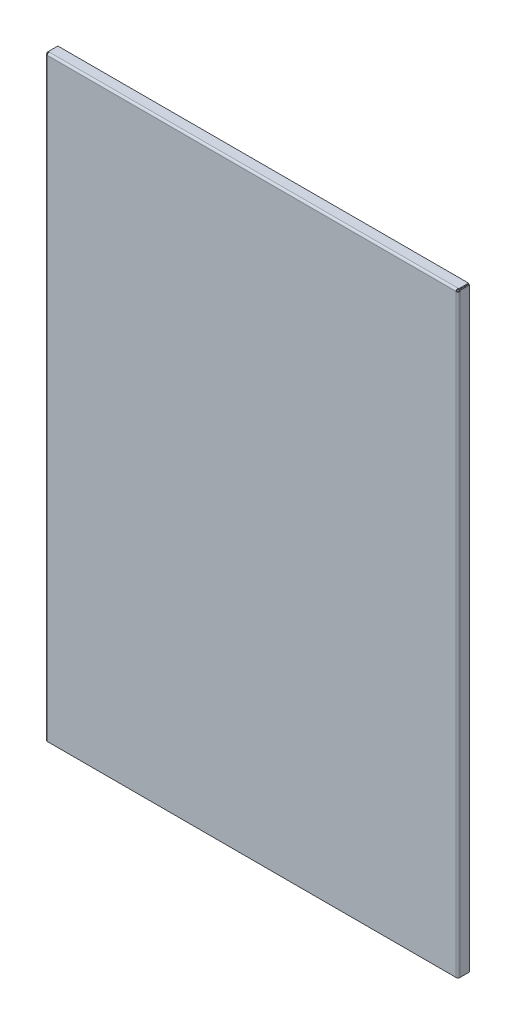
ISO-10303-21;
HEADER;
FILE_DESCRIPTION(('STEP AP214'),'2;1');
FILE_NAME('part.step','',(''),(''),'','','');
FILE_SCHEMA(('AUTOMOTIVE_DESIGN { 1 0 10303 214 1 1 1 1 }'));
ENDSEC;
DATA;
#1=APPLICATION_CONTEXT('core data for automotive mechanical design processes');
#2=APPLICATION_PROTOCOL_DEFINITION('international standard','automotive_design',2000,#1);
#3=PRODUCT_CONTEXT('',#1,'mechanical');
#4=PRODUCT('Part','Part','',(#3));
#5=PRODUCT_RELATED_PRODUCT_CATEGORY('part','',(#4));
#6=PRODUCT_DEFINITION_FORMATION('','',#4);
#7=PRODUCT_DEFINITION_CONTEXT('part definition',#1,'design');
#8=PRODUCT_DEFINITION('design','',#6,#7);
#9=PRODUCT_DEFINITION_SHAPE('','',#8);
#10=(LENGTH_UNIT() NAMED_UNIT(*) SI_UNIT(.MILLI.,.METRE.));
#11=(NAMED_UNIT(*) PLANE_ANGLE_UNIT() SI_UNIT($,.RADIAN.));
#12=(NAMED_UNIT(*) SI_UNIT($,.STERADIAN.) SOLID_ANGLE_UNIT());
#13=UNCERTAINTY_MEASURE_WITH_UNIT(LENGTH_MEASURE(1.E-05),#10,'distance_accuracy_value','');
#14=(GEOMETRIC_REPRESENTATION_CONTEXT(3) GLOBAL_UNCERTAINTY_ASSIGNED_CONTEXT((#13)) GLOBAL_UNIT_ASSIGNED_CONTEXT((#10,
#11,#12)) REPRESENTATION_CONTEXT('',''));
#15=CARTESIAN_POINT('',(0.,0.,0.));
#16=DIRECTION('',(0.,0.,1.));
#17=DIRECTION('',(1.,0.,0.));
#18=AXIS2_PLACEMENT_3D('',#15,#16,#17);
#19=CARTESIAN_POINT('',(-1.0658E-13,307.75,-1.));
#20=DIRECTION('',(-1.,0.,0.));
#21=DIRECTION('',(0.,0.,1.));
#22=AXIS2_PLACEMENT_3D('',#19,#20,#21);
#23=CYLINDRICAL_SURFACE('',#22,1.);
#24=DIRECTION('',(-1.,0.,0.));
#25=VECTOR('',#24,1.);
#26=CARTESIAN_POINT('',(0.,308.75,-1.));
#27=LINE('',#26,#25);
#28=CARTESIAN_POINT('',(212.5,308.75,-1.));
#29=VERTEX_POINT('',#28);
#30=CARTESIAN_POINT('',(-212.5,308.75,-1.));
#31=VERTEX_POINT('',#30);
#32=EDGE_CURVE('E36',#29,#31,#27,.T.);
#33=ORIENTED_EDGE('',*,*,#32,.F.);
#34=CARTESIAN_POINT('',(212.5,307.75,-1.));
#35=DIRECTION('',(-1.,0.,0.));
#36=DIRECTION('',(0.,0.,1.));
#37=AXIS2_PLACEMENT_3D('',#34,#35,#36);
#38=CIRCLE('',#37,1.);
#39=CARTESIAN_POINT('',(212.5,307.75,0.));
#40=VERTEX_POINT('',#39);
#41=EDGE_CURVE('E298',#40,#29,#38,.T.);
#42=ORIENTED_EDGE('',*,*,#41,.F.);
#43=DIRECTION('',(1.,0.,0.));
#44=VECTOR('',#43,1.);
#45=CARTESIAN_POINT('',(-106.25,307.75,0.));
#46=LINE('',#45,#44);
#47=CARTESIAN_POINT('',(-212.5,307.75,0.));
#48=VERTEX_POINT('',#47);
#49=EDGE_CURVE('E277',#48,#40,#46,.T.);
#50=ORIENTED_EDGE('',*,*,#49,.F.);
#51=CARTESIAN_POINT('',(-212.5,307.75,-1.));
#52=DIRECTION('',(1.,0.,0.));
#53=DIRECTION('',(0.,1.,0.));
#54=AXIS2_PLACEMENT_3D('',#51,#52,#53);
#55=CIRCLE('',#54,1.);
#56=EDGE_CURVE('E300',#31,#48,#55,.T.);
#57=ORIENTED_EDGE('',*,*,#56,.F.);
#58=EDGE_LOOP('',(#33,#42,#50,#57));
#59=FACE_BOUND('',#58,.T.);
#60=ADVANCED_FACE('F17',(#59),#23,.F.);
#61=CARTESIAN_POINT('',(0.,309.75,-4.873813492062));
#62=DIRECTION('',(0.,1.,0.));
#63=DIRECTION('',(1.,0.,0.));
#64=AXIS2_PLACEMENT_3D('',#61,#62,#63);
#65=PLANE('',#64);
#66=DIRECTION('',(1.,0.,0.));
#67=VECTOR('',#66,1.);
#68=CARTESIAN_POINT('',(0.,309.75,-1.));
#69=LINE('',#68,#67);
#70=CARTESIAN_POINT('',(-212.5,309.75,-1.));
#71=VERTEX_POINT('',#70);
#72=CARTESIAN_POINT('',(212.5,309.75,-1.));
#73=VERTEX_POINT('',#72);
#74=EDGE_CURVE('E11',#71,#73,#69,.T.);
#75=ORIENTED_EDGE('',*,*,#74,.T.);
#76=DIRECTION('',(1.,0.,0.));
#77=VECTOR('',#76,1.);
#78=CARTESIAN_POINT('',(212.5,309.75,-1.));
#79=LINE('',#78,#77);
#80=CARTESIAN_POINT('',(213.42928932188,309.75,-1.));
#81=VERTEX_POINT('',#80);
#82=EDGE_CURVE('E27',#73,#81,#79,.T.);
#83=ORIENTED_EDGE('',*,*,#82,.T.);
#84=DIRECTION('',(0.,0.,-1.));
#85=VECTOR('',#84,1.);
#86=CARTESIAN_POINT('',(213.42928932188,309.75,-1.));
#87=LINE('',#86,#85);
#88=CARTESIAN_POINT('',(213.42928932188,309.75,-11.));
#89=VERTEX_POINT('',#88);
#90=EDGE_CURVE('E307',#81,#89,#87,.T.);
#91=ORIENTED_EDGE('',*,*,#90,.T.);
#92=DIRECTION('',(-1.,0.,0.));
#93=VECTOR('',#92,1.);
#94=CARTESIAN_POINT('',(213.42928932188,309.75,-11.));
#95=LINE('',#94,#93);
#96=CARTESIAN_POINT('',(-213.4292893218,309.75,-11.));
#97=VERTEX_POINT('',#96);
#98=EDGE_CURVE('E310',#89,#97,#95,.T.);
#99=ORIENTED_EDGE('',*,*,#98,.T.);
#100=DIRECTION('',(0.,0.,-1.));
#101=VECTOR('',#100,1.);
#102=CARTESIAN_POINT('',(-213.4292893218,309.75,-1.));
#103=LINE('',#102,#101);
#104=CARTESIAN_POINT('',(-213.4292893218,309.75,-1.));
#105=VERTEX_POINT('',#104);
#106=EDGE_CURVE('E314',#105,#97,#103,.T.);
#107=ORIENTED_EDGE('',*,*,#106,.F.);
#108=DIRECTION('',(-1.,0.,0.));
#109=VECTOR('',#108,1.);
#110=CARTESIAN_POINT('',(-212.5,309.75,-1.));
#111=LINE('',#110,#109);
#112=EDGE_CURVE('E317',#71,#105,#111,.T.);
#113=ORIENTED_EDGE('',*,*,#112,.F.);
#114=EDGE_LOOP('',(#75,#83,#91,#99,#107,#113));
#115=FACE_BOUND('',#114,.T.);
#116=ADVANCED_FACE('F390',(#115),#65,.T.);
#117=CARTESIAN_POINT('',(-213.4292893218,309.75,-11.));
#118=DIRECTION('',(-1.,0.,0.));
#119=DIRECTION('',(0.,1.,0.));
#120=AXIS2_PLACEMENT_3D('',#117,#118,#119);
#121=PLANE('',#120);
#122=DIRECTION('',(0.,0.,1.));
#123=VECTOR('',#122,1.);
#124=CARTESIAN_POINT('',(-213.4292893218,308.75,-1.));
#125=LINE('',#124,#123);
#126=CARTESIAN_POINT('',(-213.4292893218,308.75,-11.));
#127=VERTEX_POINT('',#126);
#128=CARTESIAN_POINT('',(-213.4292893218,308.75,-1.));
#129=VERTEX_POINT('',#128);
#130=EDGE_CURVE('E313',#127,#129,#125,.T.);
#131=ORIENTED_EDGE('',*,*,#130,.T.);
#132=DIRECTION('',(0.,-1.,0.));
#133=VECTOR('',#132,1.);
#134=CARTESIAN_POINT('',(-213.4292893218,309.75,-1.));
#135=LINE('',#134,#133);
#136=EDGE_CURVE('E302',#105,#129,#135,.T.);
#137=ORIENTED_EDGE('',*,*,#136,.F.);
#138=ORIENTED_EDGE('',*,*,#106,.T.);
#139=DIRECTION('',(0.,-1.,0.));
#140=VECTOR('',#139,1.);
#141=CARTESIAN_POINT('',(-213.4292893218,309.75,-11.));
#142=LINE('',#141,#140);
#143=EDGE_CURVE('E316',#97,#127,#142,.T.);
#144=ORIENTED_EDGE('',*,*,#143,.T.);
#145=EDGE_LOOP('',(#131,#137,#138,#144));
#146=FACE_BOUND('',#145,.T.);
#147=ADVANCED_FACE('F394',(#146),#121,.T.);
#148=CARTESIAN_POINT('',(-213.4292893218,309.75,-1.));
#149=DIRECTION('',(0.,0.,1.));
#150=DIRECTION('',(0.,-1.,0.));
#151=AXIS2_PLACEMENT_3D('',#148,#149,#150);
#152=PLANE('',#151);
#153=DIRECTION('',(1.,0.,0.));
#154=VECTOR('',#153,1.);
#155=CARTESIAN_POINT('',(-212.5,308.75,-1.));
#156=LINE('',#155,#154);
#157=EDGE_CURVE('E319',#129,#31,#156,.T.);
#158=ORIENTED_EDGE('',*,*,#157,.T.);
#159=DIRECTION('',(0.,-1.,0.));
#160=VECTOR('',#159,1.);
#161=CARTESIAN_POINT('',(-212.5,309.75,-1.));
#162=LINE('',#161,#160);
#163=EDGE_CURVE('E326',#71,#31,#162,.T.);
#164=ORIENTED_EDGE('',*,*,#163,.F.);
#165=ORIENTED_EDGE('',*,*,#112,.T.);
#166=ORIENTED_EDGE('',*,*,#136,.T.);
#167=EDGE_LOOP('',(#158,#164,#165,#166));
#168=FACE_BOUND('',#167,.T.);
#169=ADVANCED_FACE('F359',(#168),#152,.T.);
#170=CARTESIAN_POINT('',(-212.5,308.75,-1.));
#171=DIRECTION('',(-1.,0.,0.));
#172=DIRECTION('',(0.,0.,1.));
#173=AXIS2_PLACEMENT_3D('',#170,#171,#172);
#174=PLANE('',#173);
#175=ORIENTED_EDGE('',*,*,#56,.T.);
#176=DIRECTION('',(0.,0.,-1.));
#177=VECTOR('',#176,1.);
#178=CARTESIAN_POINT('',(-212.5,307.75,1.));
#179=LINE('',#178,#177);
#180=CARTESIAN_POINT('',(-212.5,307.75,1.));
#181=VERTEX_POINT('',#180);
#182=EDGE_CURVE('E224',#181,#48,#179,.T.);
#183=ORIENTED_EDGE('',*,*,#182,.F.);
#184=CARTESIAN_POINT('',(-212.5,307.75,-1.));
#185=DIRECTION('',(-1.,0.,0.));
#186=DIRECTION('',(0.,0.,1.));
#187=AXIS2_PLACEMENT_3D('',#184,#185,#186);
#188=CIRCLE('',#187,2.);
#189=EDGE_CURVE('E303',#181,#71,#188,.T.);
#190=ORIENTED_EDGE('',*,*,#189,.T.);
#191=ORIENTED_EDGE('',*,*,#163,.T.);
#192=EDGE_LOOP('',(#175,#183,#190,#191));
#193=FACE_BOUND('',#192,.T.);
#194=ADVANCED_FACE('F362',(#193),#174,.T.);
#195=CARTESIAN_POINT('',(212.5,307.75,0.));
#196=DIRECTION('',(1.,0.,0.));
#197=DIRECTION('',(0.,0.,-1.));
#198=AXIS2_PLACEMENT_3D('',#195,#196,#197);
#199=PLANE('',#198);
#200=ORIENTED_EDGE('',*,*,#41,.T.);
#201=DIRECTION('',(0.,-1.,0.));
#202=VECTOR('',#201,1.);
#203=CARTESIAN_POINT('',(212.5,309.75,-1.));
#204=LINE('',#203,#202);
#205=EDGE_CURVE('E333',#73,#29,#204,.T.);
#206=ORIENTED_EDGE('',*,*,#205,.F.);
#207=CARTESIAN_POINT('',(212.5,307.75,-1.));
#208=DIRECTION('',(-1.,0.,0.));
#209=DIRECTION('',(0.,0.,1.));
#210=AXIS2_PLACEMENT_3D('',#207,#208,#209);
#211=CIRCLE('',#210,2.);
#212=CARTESIAN_POINT('',(212.5,307.75,1.));
#213=VERTEX_POINT('',#212);
#214=EDGE_CURVE('E234',#213,#73,#211,.T.);
#215=ORIENTED_EDGE('',*,*,#214,.F.);
#216=DIRECTION('',(0.,0.,-1.));
#217=VECTOR('',#216,1.);
#218=CARTESIAN_POINT('',(212.5,307.75,1.));
#219=LINE('',#218,#217);
#220=EDGE_CURVE('E339',#213,#40,#219,.T.);
#221=ORIENTED_EDGE('',*,*,#220,.T.);
#222=EDGE_LOOP('',(#200,#206,#215,#221));
#223=FACE_BOUND('',#222,.T.);
#224=ADVANCED_FACE('F384',(#223),#199,.T.);
#225=CARTESIAN_POINT('',(212.5,309.75,-1.));
#226=DIRECTION('',(0.,0.,1.));
#227=DIRECTION('',(0.,-1.,0.));
#228=AXIS2_PLACEMENT_3D('',#225,#226,#227);
#229=PLANE('',#228);
#230=DIRECTION('',(1.,0.,0.));
#231=VECTOR('',#230,1.);
#232=CARTESIAN_POINT('',(212.5,308.75,-1.));
#233=LINE('',#232,#231);
#234=CARTESIAN_POINT('',(213.42928932188,308.75,-1.));
#235=VERTEX_POINT('',#234);
#236=EDGE_CURVE('E335',#29,#235,#233,.T.);
#237=ORIENTED_EDGE('',*,*,#236,.T.);
#238=DIRECTION('',(0.,-1.,0.));
#239=VECTOR('',#238,1.);
#240=CARTESIAN_POINT('',(213.42928932188,309.75,-1.));
#241=LINE('',#240,#239);
#242=EDGE_CURVE('E343',#81,#235,#241,.T.);
#243=ORIENTED_EDGE('',*,*,#242,.F.);
#244=ORIENTED_EDGE('',*,*,#82,.F.);
#245=ORIENTED_EDGE('',*,*,#205,.T.);
#246=EDGE_LOOP('',(#237,#243,#244,#245));
#247=FACE_BOUND('',#246,.T.);
#248=ADVANCED_FACE('F388',(#247),#229,.T.);
#249=CARTESIAN_POINT('',(213.42928932188,309.75,-1.));
#250=DIRECTION('',(1.,0.,0.));
#251=DIRECTION('',(0.,-1.,0.));
#252=AXIS2_PLACEMENT_3D('',#249,#250,#251);
#253=PLANE('',#252);
#254=DIRECTION('',(0.,0.,-1.));
#255=VECTOR('',#254,1.);
#256=CARTESIAN_POINT('',(213.42928932188,308.75,-1.));
#257=LINE('',#256,#255);
#258=CARTESIAN_POINT('',(213.42928932188,308.75,-11.));
#259=VERTEX_POINT('',#258);
#260=EDGE_CURVE('E336',#235,#259,#257,.T.);
#261=ORIENTED_EDGE('',*,*,#260,.T.);
#262=DIRECTION('',(0.,-1.,0.));
#263=VECTOR('',#262,1.);
#264=CARTESIAN_POINT('',(213.42928932188,309.75,-11.));
#265=LINE('',#264,#263);
#266=EDGE_CURVE('E346',#89,#259,#265,.T.);
#267=ORIENTED_EDGE('',*,*,#266,.F.);
#268=ORIENTED_EDGE('',*,*,#90,.F.);
#269=ORIENTED_EDGE('',*,*,#242,.T.);
#270=EDGE_LOOP('',(#261,#267,#268,#269));
#271=FACE_BOUND('',#270,.T.);
#272=ADVANCED_FACE('F398',(#271),#253,.T.);
#273=CARTESIAN_POINT('',(213.42928932188,309.75,-11.));
#274=DIRECTION('',(0.,0.,-1.));
#275=DIRECTION('',(0.,1.,0.));
#276=AXIS2_PLACEMENT_3D('',#273,#274,#275);
#277=PLANE('',#276);
#278=DIRECTION('',(-1.,0.,0.));
#279=VECTOR('',#278,1.);
#280=CARTESIAN_POINT('',(213.42928932188,308.75,-11.));
#281=LINE('',#280,#279);
#282=EDGE_CURVE('E214',#259,#127,#281,.T.);
#283=ORIENTED_EDGE('',*,*,#282,.T.);
#284=ORIENTED_EDGE('',*,*,#143,.F.);
#285=ORIENTED_EDGE('',*,*,#98,.F.);
#286=ORIENTED_EDGE('',*,*,#266,.T.);
#287=EDGE_LOOP('',(#283,#284,#285,#286));
#288=FACE_BOUND('',#287,.T.);
#289=ADVANCED_FACE('F396',(#288),#277,.T.);
#290=CARTESIAN_POINT('',(0.,308.75,-4.873813492062));
#291=DIRECTION('',(0.,1.,0.));
#292=DIRECTION('',(1.,0.,0.));
#293=AXIS2_PLACEMENT_3D('',#290,#291,#292);
#294=PLANE('',#293);
#295=ORIENTED_EDGE('',*,*,#32,.T.);
#296=ORIENTED_EDGE('',*,*,#157,.F.);
#297=ORIENTED_EDGE('',*,*,#130,.F.);
#298=ORIENTED_EDGE('',*,*,#282,.F.);
#299=ORIENTED_EDGE('',*,*,#260,.F.);
#300=ORIENTED_EDGE('',*,*,#236,.F.);
#301=EDGE_LOOP('',(#295,#296,#297,#298,#299,#300));
#302=FACE_BOUND('',#301,.T.);
#303=ADVANCED_FACE('F353',(#302),#294,.F.);
#304=CARTESIAN_POINT('',(-1.0658E-13,307.75,-1.));
#305=DIRECTION('',(-1.,0.,0.));
#306=DIRECTION('',(0.,0.,1.));
#307=AXIS2_PLACEMENT_3D('',#304,#305,#306);
#308=CYLINDRICAL_SURFACE('',#307,2.);
#309=ORIENTED_EDGE('',*,*,#74,.F.);
#310=ORIENTED_EDGE('',*,*,#189,.F.);
#311=DIRECTION('',(-1.,0.,0.));
#312=VECTOR('',#311,1.);
#313=CARTESIAN_POINT('',(-106.25,307.75,1.));
#314=LINE('',#313,#312);
#315=EDGE_CURVE('E201',#213,#181,#314,.T.);
#316=ORIENTED_EDGE('',*,*,#315,.F.);
#317=ORIENTED_EDGE('',*,*,#214,.T.);
#318=EDGE_LOOP('',(#309,#310,#316,#317));
#319=FACE_BOUND('',#318,.T.);
#320=ADVANCED_FACE('F367',(#319),#308,.T.);
#321=CARTESIAN_POINT('',(-212.5,-1.,-1.));
#322=DIRECTION('',(0.,-1.,0.));
#323=DIRECTION('',(0.,0.,1.));
#324=AXIS2_PLACEMENT_3D('',#321,#322,#323);
#325=CYLINDRICAL_SURFACE('',#324,1.);
#326=DIRECTION('',(0.,-1.,0.));
#327=VECTOR('',#326,1.);
#328=CARTESIAN_POINT('',(-213.5,-0.768510883472,-1.));
#329=LINE('',#328,#327);
#330=CARTESIAN_POINT('',(-213.5,307.75,-1.));
#331=VERTEX_POINT('',#330);
#332=CARTESIAN_POINT('',(-213.5,-309.75,-1.));
#333=VERTEX_POINT('',#332);
#334=EDGE_CURVE('E216',#331,#333,#329,.T.);
#335=ORIENTED_EDGE('',*,*,#334,.F.);
#336=CARTESIAN_POINT('',(-212.5,307.75,-1.));
#337=DIRECTION('',(0.,-1.,0.));
#338=DIRECTION('',(-1.0658E-13,0.,1.));
#339=AXIS2_PLACEMENT_3D('',#336,#337,#338);
#340=CIRCLE('',#339,1.);
#341=EDGE_CURVE('E220',#48,#331,#340,.T.);
#342=ORIENTED_EDGE('',*,*,#341,.F.);
#343=DIRECTION('',(0.,1.,0.));
#344=VECTOR('',#343,1.);
#345=CARTESIAN_POINT('',(-212.5,-154.875,0.));
#346=LINE('',#345,#344);
#347=CARTESIAN_POINT('',(-212.5,-309.75,0.));
#348=VERTEX_POINT('',#347);
#349=EDGE_CURVE('E207',#348,#48,#346,.T.);
#350=ORIENTED_EDGE('',*,*,#349,.F.);
#351=CARTESIAN_POINT('',(-212.5,-309.75,-1.));
#352=DIRECTION('',(0.,1.,0.));
#353=DIRECTION('',(-1.,0.,0.));
#354=AXIS2_PLACEMENT_3D('',#351,#352,#353);
#355=CIRCLE('',#354,1.);
#356=EDGE_CURVE('E228',#333,#348,#355,.T.);
#357=ORIENTED_EDGE('',*,*,#356,.F.);
#358=EDGE_LOOP('',(#335,#342,#350,#357));
#359=FACE_BOUND('',#358,.T.);
#360=ADVANCED_FACE('F462',(#359),#325,.F.);
#361=CARTESIAN_POINT('',(-214.5,-309.75,-1.));
#362=DIRECTION('',(0.,-1.,0.));
#363=DIRECTION('',(1.,0.,0.));
#364=AXIS2_PLACEMENT_3D('',#361,#362,#363);
#365=PLANE('',#364);
#366=DIRECTION('',(0.,0.,1.));
#367=VECTOR('',#366,1.);
#368=CARTESIAN_POINT('',(-213.5,-309.75,3.523893421169));
#369=LINE('',#368,#367);
#370=CARTESIAN_POINT('',(-213.5,-309.75,-11.));
#371=VERTEX_POINT('',#370);
#372=EDGE_CURVE('E238',#371,#333,#369,.T.);
#373=ORIENTED_EDGE('',*,*,#372,.T.);
#374=ORIENTED_EDGE('',*,*,#356,.T.);
#375=DIRECTION('',(1.,0.,0.));
#376=VECTOR('',#375,1.);
#377=CARTESIAN_POINT('',(-214.5,-309.75,0.));
#378=LINE('',#377,#376);
#379=CARTESIAN_POINT('',(212.5,-309.75,0.));
#380=VERTEX_POINT('',#379);
#381=EDGE_CURVE('E199',#348,#380,#378,.T.);
#382=ORIENTED_EDGE('',*,*,#381,.T.);
#383=CARTESIAN_POINT('',(212.5,-309.75,-1.));
#384=DIRECTION('',(0.,1.,0.));
#385=DIRECTION('',(2.1316E-13,0.,1.));
#386=AXIS2_PLACEMENT_3D('',#383,#384,#385);
#387=CIRCLE('',#386,1.);
#388=CARTESIAN_POINT('',(213.5,-309.75,-1.));
#389=VERTEX_POINT('',#388);
#390=EDGE_CURVE('E172',#380,#389,#387,.T.);
#391=ORIENTED_EDGE('',*,*,#390,.T.);
#392=DIRECTION('',(0.,0.,-1.));
#393=VECTOR('',#392,1.);
#394=CARTESIAN_POINT('',(213.5,-309.75,-1.));
#395=LINE('',#394,#393);
#396=CARTESIAN_POINT('',(213.5,-309.75,-11.));
#397=VERTEX_POINT('',#396);
#398=EDGE_CURVE('E186',#389,#397,#395,.T.);
#399=ORIENTED_EDGE('',*,*,#398,.T.);
#400=DIRECTION('',(-1.,0.,0.));
#401=VECTOR('',#400,1.);
#402=CARTESIAN_POINT('',(214.5,-309.75,-11.));
#403=LINE('',#402,#401);
#404=CARTESIAN_POINT('',(214.5,-309.75,-11.));
#405=VERTEX_POINT('',#404);
#406=EDGE_CURVE('E192',#405,#397,#403,.T.);
#407=ORIENTED_EDGE('',*,*,#406,.F.);
#408=DIRECTION('',(0.,0.,-1.));
#409=VECTOR('',#408,1.);
#410=CARTESIAN_POINT('',(214.5,-309.75,3.523893421169));
#411=LINE('',#410,#409);
#412=CARTESIAN_POINT('',(214.5,-309.75,-1.));
#413=VERTEX_POINT('',#412);
#414=EDGE_CURVE('E282',#413,#405,#411,.T.);
#415=ORIENTED_EDGE('',*,*,#414,.F.);
#416=CARTESIAN_POINT('',(212.5,-309.75,-1.));
#417=DIRECTION('',(0.,1.,0.));
#418=DIRECTION('',(2.1316E-13,0.,1.));
#419=AXIS2_PLACEMENT_3D('',#416,#417,#418);
#420=CIRCLE('',#419,2.);
#421=CARTESIAN_POINT('',(212.5,-309.75,1.));
#422=VERTEX_POINT('',#421);
#423=EDGE_CURVE('E273',#422,#413,#420,.T.);
#424=ORIENTED_EDGE('',*,*,#423,.F.);
#425=DIRECTION('',(-1.,0.,0.));
#426=VECTOR('',#425,1.);
#427=CARTESIAN_POINT('',(-214.5,-309.75,1.));
#428=LINE('',#427,#426);
#429=CARTESIAN_POINT('',(-212.5,-309.75,1.));
#430=VERTEX_POINT('',#429);
#431=EDGE_CURVE('E21',#422,#430,#428,.T.);
#432=ORIENTED_EDGE('',*,*,#431,.T.);
#433=CARTESIAN_POINT('',(-212.5,-309.75,-1.));
#434=DIRECTION('',(0.,-1.,0.));
#435=DIRECTION('',(0.,0.,1.));
#436=AXIS2_PLACEMENT_3D('',#433,#434,#435);
#437=CIRCLE('',#436,2.);
#438=CARTESIAN_POINT('',(-214.5,-309.75,-1.));
#439=VERTEX_POINT('',#438);
#440=EDGE_CURVE('E223',#430,#439,#437,.T.);
#441=ORIENTED_EDGE('',*,*,#440,.T.);
#442=DIRECTION('',(0.,0.,-1.));
#443=VECTOR('',#442,1.);
#444=CARTESIAN_POINT('',(-214.5,-309.75,3.523893421169));
#445=LINE('',#444,#443);
#446=CARTESIAN_POINT('',(-214.5,-309.75,-11.));
#447=VERTEX_POINT('',#446);
#448=EDGE_CURVE('E231',#439,#447,#445,.T.);
#449=ORIENTED_EDGE('',*,*,#448,.T.);
#450=DIRECTION('',(1.,0.,0.));
#451=VECTOR('',#450,1.);
#452=CARTESIAN_POINT('',(-214.5,-309.75,-11.));
#453=LINE('',#452,#451);
#454=EDGE_CURVE('E235',#447,#371,#453,.T.);
#455=ORIENTED_EDGE('',*,*,#454,.T.);
#456=EDGE_LOOP('',(#373,#374,#382,#391,#399,#407,#415,#424,#432,#441,#449,#455));
#457=FACE_BOUND('',#456,.T.);
#458=ADVANCED_FACE('F373',(#457),#365,.T.);
#459=CARTESIAN_POINT('',(-214.5,-0.537021766944,-4.870693072593));
#460=DIRECTION('',(-1.,0.,0.));
#461=DIRECTION('',(0.,0.,1.));
#462=AXIS2_PLACEMENT_3D('',#459,#460,#461);
#463=PLANE('',#462);
#464=DIRECTION('',(0.,1.,0.));
#465=VECTOR('',#464,1.);
#466=CARTESIAN_POINT('',(-214.5,-0.768510883472,-1.));
#467=LINE('',#466,#465);
#468=CARTESIAN_POINT('',(-214.5,307.75,-1.));
#469=VERTEX_POINT('',#468);
#470=EDGE_CURVE('E241',#439,#469,#467,.T.);
#471=ORIENTED_EDGE('',*,*,#470,.T.);
#472=DIRECTION('',(0.,1.,0.));
#473=VECTOR('',#472,1.);
#474=CARTESIAN_POINT('',(-214.5,307.75,-1.));
#475=LINE('',#474,#473);
#476=CARTESIAN_POINT('',(-214.5,308.67928932188,-1.));
#477=VERTEX_POINT('',#476);
#478=EDGE_CURVE('E244',#469,#477,#475,.T.);
#479=ORIENTED_EDGE('',*,*,#478,.T.);
#480=DIRECTION('',(0.,0.,-1.));
#481=VECTOR('',#480,1.);
#482=CARTESIAN_POINT('',(-214.5,308.67928932188,-1.));
#483=LINE('',#482,#481);
#484=CARTESIAN_POINT('',(-214.5,308.67928932188,-11.));
#485=VERTEX_POINT('',#484);
#486=EDGE_CURVE('E247',#477,#485,#483,.T.);
#487=ORIENTED_EDGE('',*,*,#486,.T.);
#488=DIRECTION('',(0.,-1.,0.));
#489=VECTOR('',#488,1.);
#490=CARTESIAN_POINT('',(-214.5,308.67928932188,-11.));
#491=LINE('',#490,#489);
#492=EDGE_CURVE('E230',#485,#447,#491,.T.);
#493=ORIENTED_EDGE('',*,*,#492,.T.);
#494=ORIENTED_EDGE('',*,*,#448,.F.);
#495=EDGE_LOOP('',(#471,#479,#487,#493,#494));
#496=FACE_BOUND('',#495,.T.);
#497=ADVANCED_FACE('F480',(#496),#463,.T.);
#498=CARTESIAN_POINT('',(-212.5,307.75,0.));
#499=DIRECTION('',(0.,1.,0.));
#500=DIRECTION('',(0.,0.,1.));
#501=AXIS2_PLACEMENT_3D('',#498,#499,#500);
#502=PLANE('',#501);
#503=ORIENTED_EDGE('',*,*,#341,.T.);
#504=DIRECTION('',(1.,0.,0.));
#505=VECTOR('',#504,1.);
#506=CARTESIAN_POINT('',(-214.5,307.75,-1.));
#507=LINE('',#506,#505);
#508=EDGE_CURVE('E254',#469,#331,#507,.T.);
#509=ORIENTED_EDGE('',*,*,#508,.F.);
#510=CARTESIAN_POINT('',(-212.5,307.75,-1.));
#511=DIRECTION('',(0.,-1.,0.));
#512=DIRECTION('',(-1.0658E-13,0.,1.));
#513=AXIS2_PLACEMENT_3D('',#510,#511,#512);
#514=CIRCLE('',#513,2.);
#515=EDGE_CURVE('E219',#181,#469,#514,.T.);
#516=ORIENTED_EDGE('',*,*,#515,.F.);
#517=ORIENTED_EDGE('',*,*,#182,.T.);
#518=EDGE_LOOP('',(#503,#509,#516,#517));
#519=FACE_BOUND('',#518,.T.);
#520=ADVANCED_FACE('F489',(#519),#502,.T.);
#521=CARTESIAN_POINT('',(-214.5,307.75,-1.));
#522=DIRECTION('',(0.,0.,1.));
#523=DIRECTION('',(1.,0.,0.));
#524=AXIS2_PLACEMENT_3D('',#521,#522,#523);
#525=PLANE('',#524);
#526=DIRECTION('',(0.,1.,0.));
#527=VECTOR('',#526,1.);
#528=CARTESIAN_POINT('',(-213.5,307.75,-1.));
#529=LINE('',#528,#527);
#530=CARTESIAN_POINT('',(-213.5,308.67928932188,-1.));
#531=VERTEX_POINT('',#530);
#532=EDGE_CURVE('E257',#331,#531,#529,.T.);
#533=ORIENTED_EDGE('',*,*,#532,.T.);
#534=DIRECTION('',(1.,0.,0.));
#535=VECTOR('',#534,1.);
#536=CARTESIAN_POINT('',(-214.5,308.67928932188,-1.));
#537=LINE('',#536,#535);
#538=EDGE_CURVE('E264',#477,#531,#537,.T.);
#539=ORIENTED_EDGE('',*,*,#538,.F.);
#540=ORIENTED_EDGE('',*,*,#478,.F.);
#541=ORIENTED_EDGE('',*,*,#508,.T.);
#542=EDGE_LOOP('',(#533,#539,#540,#541));
#543=FACE_BOUND('',#542,.T.);
#544=ADVANCED_FACE('F499',(#543),#525,.T.);
#545=CARTESIAN_POINT('',(-214.5,308.67928932188,-1.));
#546=DIRECTION('',(0.,1.,0.));
#547=DIRECTION('',(-1.,0.,0.));
#548=AXIS2_PLACEMENT_3D('',#545,#546,#547);
#549=PLANE('',#548);
#550=DIRECTION('',(0.,0.,-1.));
#551=VECTOR('',#550,1.);
#552=CARTESIAN_POINT('',(-213.5,308.67928932188,-1.));
#553=LINE('',#552,#551);
#554=CARTESIAN_POINT('',(-213.5,308.67928932188,-11.));
#555=VERTEX_POINT('',#554);
#556=EDGE_CURVE('E258',#531,#555,#553,.T.);
#557=ORIENTED_EDGE('',*,*,#556,.T.);
#558=DIRECTION('',(1.,0.,0.));
#559=VECTOR('',#558,1.);
#560=CARTESIAN_POINT('',(-214.5,308.67928932188,-11.));
#561=LINE('',#560,#559);
#562=EDGE_CURVE('E218',#485,#555,#561,.T.);
#563=ORIENTED_EDGE('',*,*,#562,.F.);
#564=ORIENTED_EDGE('',*,*,#486,.F.);
#565=ORIENTED_EDGE('',*,*,#538,.T.);
#566=EDGE_LOOP('',(#557,#563,#564,#565));
#567=FACE_BOUND('',#566,.T.);
#568=ADVANCED_FACE('F509',(#567),#549,.T.);
#569=CARTESIAN_POINT('',(-214.5,308.67928932188,-11.));
#570=DIRECTION('',(0.,0.,-1.));
#571=DIRECTION('',(-1.,0.,0.));
#572=AXIS2_PLACEMENT_3D('',#569,#570,#571);
#573=PLANE('',#572);
#574=DIRECTION('',(0.,-1.,0.));
#575=VECTOR('',#574,1.);
#576=CARTESIAN_POINT('',(-213.5,308.67928932188,-11.));
#577=LINE('',#576,#575);
#578=EDGE_CURVE('E266',#555,#371,#577,.T.);
#579=ORIENTED_EDGE('',*,*,#578,.T.);
#580=ORIENTED_EDGE('',*,*,#454,.F.);
#581=ORIENTED_EDGE('',*,*,#492,.F.);
#582=ORIENTED_EDGE('',*,*,#562,.T.);
#583=EDGE_LOOP('',(#579,#580,#581,#582));
#584=FACE_BOUND('',#583,.T.);
#585=ADVANCED_FACE('F519',(#584),#573,.T.);
#586=CARTESIAN_POINT('',(-213.5,-0.537021766944,-4.870693072593));
#587=DIRECTION('',(-1.,0.,0.));
#588=DIRECTION('',(0.,0.,1.));
#589=AXIS2_PLACEMENT_3D('',#586,#587,#588);
#590=PLANE('',#589);
#591=ORIENTED_EDGE('',*,*,#334,.T.);
#592=ORIENTED_EDGE('',*,*,#372,.F.);
#593=ORIENTED_EDGE('',*,*,#578,.F.);
#594=ORIENTED_EDGE('',*,*,#556,.F.);
#595=ORIENTED_EDGE('',*,*,#532,.F.);
#596=EDGE_LOOP('',(#591,#592,#593,#594,#595));
#597=FACE_BOUND('',#596,.T.);
#598=ADVANCED_FACE('F529',(#597),#590,.F.);
#599=CARTESIAN_POINT('',(-212.5,-1.,-1.));
#600=DIRECTION('',(0.,-1.,0.));
#601=DIRECTION('',(0.,0.,1.));
#602=AXIS2_PLACEMENT_3D('',#599,#600,#601);
#603=CYLINDRICAL_SURFACE('',#602,2.);
#604=ORIENTED_EDGE('',*,*,#470,.F.);
#605=ORIENTED_EDGE('',*,*,#440,.F.);
#606=DIRECTION('',(0.,-1.,0.));
#607=VECTOR('',#606,1.);
#608=CARTESIAN_POINT('',(-212.5,-154.875,1.));
#609=LINE('',#608,#607);
#610=EDGE_CURVE('E198',#181,#430,#609,.T.);
#611=ORIENTED_EDGE('',*,*,#610,.F.);
#612=ORIENTED_EDGE('',*,*,#515,.T.);
#613=EDGE_LOOP('',(#604,#605,#611,#612));
#614=FACE_BOUND('',#613,.T.);
#615=ADVANCED_FACE('F371',(#614),#603,.T.);
#616=CARTESIAN_POINT('',(212.5,-1.,-1.));
#617=DIRECTION('',(0.,1.,0.));
#618=DIRECTION('',(0.,0.,1.));
#619=AXIS2_PLACEMENT_3D('',#616,#617,#618);
#620=CYLINDRICAL_SURFACE('',#619,1.);
#621=DIRECTION('',(0.,1.,0.));
#622=VECTOR('',#621,1.);
#623=CARTESIAN_POINT('',(213.5,-0.768510883472,-1.));
#624=LINE('',#623,#622);
#625=CARTESIAN_POINT('',(213.5,307.75,-1.));
#626=VERTEX_POINT('',#625);
#627=EDGE_CURVE('E177',#389,#626,#624,.T.);
#628=ORIENTED_EDGE('',*,*,#627,.F.);
#629=ORIENTED_EDGE('',*,*,#390,.F.);
#630=DIRECTION('',(0.,-1.,0.));
#631=VECTOR('',#630,1.);
#632=CARTESIAN_POINT('',(212.5,153.875,0.));
#633=LINE('',#632,#631);
#634=EDGE_CURVE('E227',#40,#380,#633,.T.);
#635=ORIENTED_EDGE('',*,*,#634,.F.);
#636=CARTESIAN_POINT('',(212.5,307.75,-1.));
#637=DIRECTION('',(0.,-1.,0.));
#638=DIRECTION('',(1.,0.,0.));
#639=AXIS2_PLACEMENT_3D('',#636,#637,#638);
#640=CIRCLE('',#639,1.);
#641=EDGE_CURVE('E162',#626,#40,#640,.T.);
#642=ORIENTED_EDGE('',*,*,#641,.F.);
#643=EDGE_LOOP('',(#628,#629,#635,#642));
#644=FACE_BOUND('',#643,.T.);
#645=ADVANCED_FACE('F548',(#644),#620,.F.);
#646=CARTESIAN_POINT('',(214.5,-0.537021766944,-4.870693072593));
#647=DIRECTION('',(1.,0.,0.));
#648=DIRECTION('',(0.,0.,-1.));
#649=AXIS2_PLACEMENT_3D('',#646,#647,#648);
#650=PLANE('',#649);
#651=DIRECTION('',(0.,-1.,0.));
#652=VECTOR('',#651,1.);
#653=CARTESIAN_POINT('',(214.5,-0.768510883472,-1.));
#654=LINE('',#653,#652);
#655=CARTESIAN_POINT('',(214.5,307.75,-1.));
#656=VERTEX_POINT('',#655);
#657=EDGE_CURVE('E261',#656,#413,#654,.T.);
#658=ORIENTED_EDGE('',*,*,#657,.T.);
#659=ORIENTED_EDGE('',*,*,#414,.T.);
#660=DIRECTION('',(0.,1.,0.));
#661=VECTOR('',#660,1.);
#662=CARTESIAN_POINT('',(214.5,-309.75,-11.));
#663=LINE('',#662,#661);
#664=CARTESIAN_POINT('',(214.5,308.67928932188,-11.));
#665=VERTEX_POINT('',#664);
#666=EDGE_CURVE('E275',#405,#665,#663,.T.);
#667=ORIENTED_EDGE('',*,*,#666,.T.);
#668=DIRECTION('',(0.,0.,-1.));
#669=VECTOR('',#668,1.);
#670=CARTESIAN_POINT('',(214.5,308.67928932188,-1.));
#671=LINE('',#670,#669);
#672=CARTESIAN_POINT('',(214.5,308.67928932188,-1.));
#673=VERTEX_POINT('',#672);
#674=EDGE_CURVE('E173',#673,#665,#671,.T.);
#675=ORIENTED_EDGE('',*,*,#674,.F.);
#676=DIRECTION('',(0.,1.,0.));
#677=VECTOR('',#676,1.);
#678=CARTESIAN_POINT('',(214.5,307.75,-1.));
#679=LINE('',#678,#677);
#680=EDGE_CURVE('E159',#656,#673,#679,.T.);
#681=ORIENTED_EDGE('',*,*,#680,.F.);
#682=EDGE_LOOP('',(#658,#659,#667,#675,#681));
#683=FACE_BOUND('',#682,.T.);
#684=ADVANCED_FACE('F376',(#683),#650,.T.);
#685=CARTESIAN_POINT('',(214.5,308.67928932188,-11.));
#686=DIRECTION('',(0.,1.,0.));
#687=DIRECTION('',(1.,0.,0.));
#688=AXIS2_PLACEMENT_3D('',#685,#686,#687);
#689=PLANE('',#688);
#690=DIRECTION('',(0.,0.,1.));
#691=VECTOR('',#690,1.);
#692=CARTESIAN_POINT('',(213.5,308.67928932188,-1.));
#693=LINE('',#692,#691);
#694=CARTESIAN_POINT('',(213.5,308.67928932188,-11.));
#695=VERTEX_POINT('',#694);
#696=CARTESIAN_POINT('',(213.5,308.67928932188,-1.));
#697=VERTEX_POINT('',#696);
#698=EDGE_CURVE('E165',#695,#697,#693,.T.);
#699=ORIENTED_EDGE('',*,*,#698,.T.);
#700=DIRECTION('',(-1.,0.,0.));
#701=VECTOR('',#700,1.);
#702=CARTESIAN_POINT('',(214.5,308.67928932188,-1.));
#703=LINE('',#702,#701);
#704=EDGE_CURVE('E152',#673,#697,#703,.T.);
#705=ORIENTED_EDGE('',*,*,#704,.F.);
#706=ORIENTED_EDGE('',*,*,#674,.T.);
#707=DIRECTION('',(-1.,0.,0.));
#708=VECTOR('',#707,1.);
#709=CARTESIAN_POINT('',(214.5,308.67928932188,-11.));
#710=LINE('',#709,#708);
#711=EDGE_CURVE('E168',#665,#695,#710,.T.);
#712=ORIENTED_EDGE('',*,*,#711,.T.);
#713=EDGE_LOOP('',(#699,#705,#706,#712));
#714=FACE_BOUND('',#713,.T.);
#715=ADVANCED_FACE('F166',(#714),#689,.T.);
#716=CARTESIAN_POINT('',(214.5,308.67928932188,-1.));
#717=DIRECTION('',(0.,0.,1.));
#718=DIRECTION('',(1.,0.,0.));
#719=AXIS2_PLACEMENT_3D('',#716,#717,#718);
#720=PLANE('',#719);
#721=DIRECTION('',(0.,-1.,0.));
#722=VECTOR('',#721,1.);
#723=CARTESIAN_POINT('',(213.5,307.75,-1.));
#724=LINE('',#723,#722);
#725=EDGE_CURVE('E156',#697,#626,#724,.T.);
#726=ORIENTED_EDGE('',*,*,#725,.T.);
#727=DIRECTION('',(-1.,0.,0.));
#728=VECTOR('',#727,1.);
#729=CARTESIAN_POINT('',(214.5,307.75,-1.));
#730=LINE('',#729,#728);
#731=EDGE_CURVE('E183',#656,#626,#730,.T.);
#732=ORIENTED_EDGE('',*,*,#731,.F.);
#733=ORIENTED_EDGE('',*,*,#680,.T.);
#734=ORIENTED_EDGE('',*,*,#704,.T.);
#735=EDGE_LOOP('',(#726,#732,#733,#734));
#736=FACE_BOUND('',#735,.T.);
#737=ADVANCED_FACE('F154',(#736),#720,.T.);
#738=CARTESIAN_POINT('',(213.5,307.75,-1.));
#739=DIRECTION('',(0.,1.,0.));
#740=DIRECTION('',(0.,0.,1.));
#741=AXIS2_PLACEMENT_3D('',#738,#739,#740);
#742=PLANE('',#741);
#743=ORIENTED_EDGE('',*,*,#641,.T.);
#744=ORIENTED_EDGE('',*,*,#220,.F.);
#745=CARTESIAN_POINT('',(212.5,307.75,-1.));
#746=DIRECTION('',(0.,1.,0.));
#747=DIRECTION('',(0.,0.,1.));
#748=AXIS2_PLACEMENT_3D('',#745,#746,#747);
#749=CIRCLE('',#748,2.);
#750=EDGE_CURVE('E185',#213,#656,#749,.T.);
#751=ORIENTED_EDGE('',*,*,#750,.T.);
#752=ORIENTED_EDGE('',*,*,#731,.T.);
#753=EDGE_LOOP('',(#743,#744,#751,#752));
#754=FACE_BOUND('',#753,.T.);
#755=ADVANCED_FACE('F381',(#754),#742,.T.);
#756=CARTESIAN_POINT('',(214.5,-309.75,-11.));
#757=DIRECTION('',(0.,0.,-1.));
#758=DIRECTION('',(-1.,0.,0.));
#759=AXIS2_PLACEMENT_3D('',#756,#757,#758);
#760=PLANE('',#759);
#761=DIRECTION('',(0.,1.,0.));
#762=VECTOR('',#761,1.);
#763=CARTESIAN_POINT('',(213.5,-309.75,-11.));
#764=LINE('',#763,#762);
#765=EDGE_CURVE('E191',#397,#695,#764,.T.);
#766=ORIENTED_EDGE('',*,*,#765,.T.);
#767=ORIENTED_EDGE('',*,*,#711,.F.);
#768=ORIENTED_EDGE('',*,*,#666,.F.);
#769=ORIENTED_EDGE('',*,*,#406,.T.);
#770=EDGE_LOOP('',(#766,#767,#768,#769));
#771=FACE_BOUND('',#770,.T.);
#772=ADVANCED_FACE('F590',(#771),#760,.T.);
#773=CARTESIAN_POINT('',(213.5,-0.537021766944,-4.870693072593));
#774=DIRECTION('',(1.,0.,0.));
#775=DIRECTION('',(0.,0.,-1.));
#776=AXIS2_PLACEMENT_3D('',#773,#774,#775);
#777=PLANE('',#776);
#778=ORIENTED_EDGE('',*,*,#627,.T.);
#779=ORIENTED_EDGE('',*,*,#725,.F.);
#780=ORIENTED_EDGE('',*,*,#698,.F.);
#781=ORIENTED_EDGE('',*,*,#765,.F.);
#782=ORIENTED_EDGE('',*,*,#398,.F.);
#783=EDGE_LOOP('',(#778,#779,#780,#781,#782));
#784=FACE_BOUND('',#783,.T.);
#785=ADVANCED_FACE('F175',(#784),#777,.F.);
#786=CARTESIAN_POINT('',(212.5,-1.,-1.));
#787=DIRECTION('',(0.,1.,0.));
#788=DIRECTION('',(0.,0.,1.));
#789=AXIS2_PLACEMENT_3D('',#786,#787,#788);
#790=CYLINDRICAL_SURFACE('',#789,2.);
#791=ORIENTED_EDGE('',*,*,#657,.F.);
#792=ORIENTED_EDGE('',*,*,#750,.F.);
#793=DIRECTION('',(0.,1.,0.));
#794=VECTOR('',#793,1.);
#795=CARTESIAN_POINT('',(212.5,153.875,1.));
#796=LINE('',#795,#794);
#797=EDGE_CURVE('E196',#422,#213,#796,.T.);
#798=ORIENTED_EDGE('',*,*,#797,.F.);
#799=ORIENTED_EDGE('',*,*,#423,.T.);
#800=EDGE_LOOP('',(#791,#792,#798,#799));
#801=FACE_BOUND('',#800,.T.);
#802=ADVANCED_FACE('F377',(#801),#790,.T.);
#803=CARTESIAN_POINT('',(0.,-2.1396E-13,0.));
#804=DIRECTION('',(0.,0.,1.));
#805=DIRECTION('',(1.,0.,0.));
#806=AXIS2_PLACEMENT_3D('',#803,#804,#805);
#807=PLANE('',#806);
#808=ORIENTED_EDGE('',*,*,#49,.T.);
#809=ORIENTED_EDGE('',*,*,#634,.T.);
#810=ORIENTED_EDGE('',*,*,#381,.F.);
#811=ORIENTED_EDGE('',*,*,#349,.T.);
#812=EDGE_LOOP('',(#808,#809,#810,#811));
#813=FACE_BOUND('',#812,.T.);
#814=ADVANCED_FACE('F616',(#813),#807,.F.);
#815=CARTESIAN_POINT('',(0.,-2.1462E-13,1.));
#816=DIRECTION('',(0.,0.,1.));
#817=DIRECTION('',(1.,0.,0.));
#818=AXIS2_PLACEMENT_3D('',#815,#816,#817);
#819=PLANE('',#818);
#820=ORIENTED_EDGE('',*,*,#315,.T.);
#821=ORIENTED_EDGE('',*,*,#610,.T.);
#822=ORIENTED_EDGE('',*,*,#431,.F.);
#823=ORIENTED_EDGE('',*,*,#797,.T.);
#824=EDGE_LOOP('',(#820,#821,#822,#823));
#825=FACE_BOUND('',#824,.T.);
#826=ADVANCED_FACE('F19',(#825),#819,.T.);
#827=CLOSED_SHELL('',(#60,#116,#147,#169,#194,#224,#248,#272,#289,#303,#320,#360,#458,#497,#520,
#544,#568,#585,#598,#615,#645,#684,#715,#737,#755,#772,#785,#802,#814,#826));
#828=MANIFOLD_SOLID_BREP('B1',#827);
#829=ADVANCED_BREP_SHAPE_REPRESENTATION('',(#18,#828),#14);
#830=SHAPE_DEFINITION_REPRESENTATION(#9,#829);
ENDSEC;
END-ISO-10303-21;
